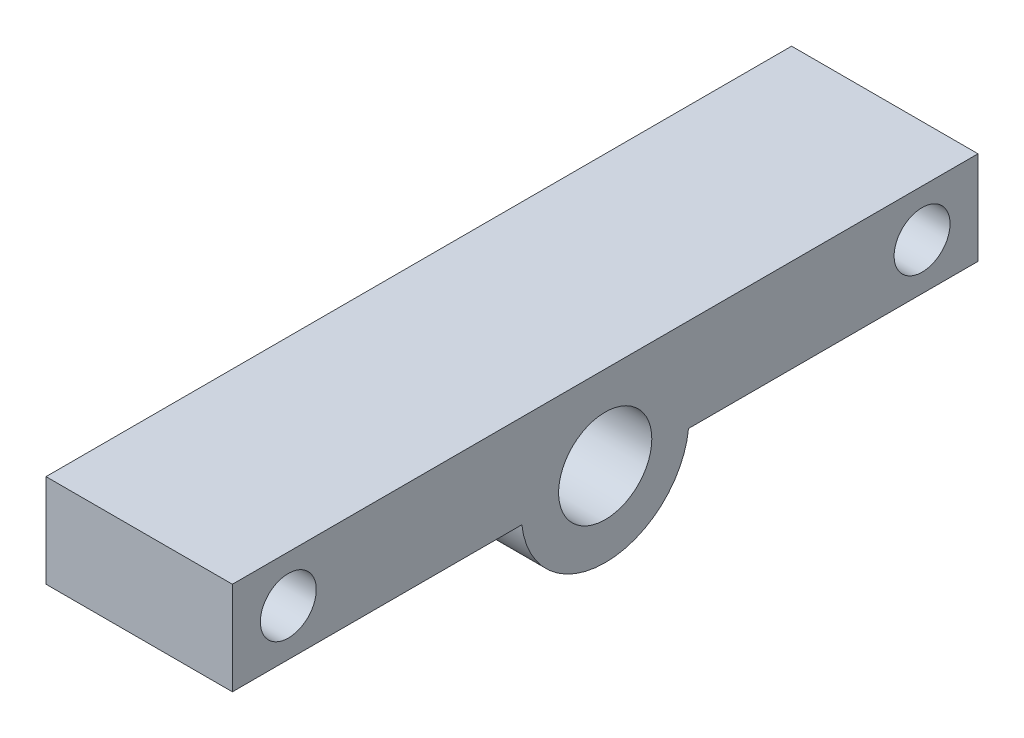
ISO-10303-21;
HEADER;
FILE_DESCRIPTION(('STEP AP214'),'2;1');
FILE_NAME('part.step','',(''),(''),'','','');
FILE_SCHEMA(('AUTOMOTIVE_DESIGN { 1 0 10303 214 1 1 1 1 }'));
ENDSEC;
DATA;
#1=APPLICATION_CONTEXT('core data for automotive mechanical design processes');
#2=APPLICATION_PROTOCOL_DEFINITION('international standard','automotive_design',2000,#1);
#3=PRODUCT_CONTEXT('',#1,'mechanical');
#4=PRODUCT('Part','Part','',(#3));
#5=PRODUCT_RELATED_PRODUCT_CATEGORY('part','',(#4));
#6=PRODUCT_DEFINITION_FORMATION('','',#4);
#7=PRODUCT_DEFINITION_CONTEXT('part definition',#1,'design');
#8=PRODUCT_DEFINITION('design','',#6,#7);
#9=PRODUCT_DEFINITION_SHAPE('','',#8);
#10=(LENGTH_UNIT() NAMED_UNIT(*) SI_UNIT(.MILLI.,.METRE.));
#11=(NAMED_UNIT(*) PLANE_ANGLE_UNIT() SI_UNIT($,.RADIAN.));
#12=(NAMED_UNIT(*) SI_UNIT($,.STERADIAN.) SOLID_ANGLE_UNIT());
#13=UNCERTAINTY_MEASURE_WITH_UNIT(LENGTH_MEASURE(1.E-05),#10,'distance_accuracy_value','');
#14=(GEOMETRIC_REPRESENTATION_CONTEXT(3) GLOBAL_UNCERTAINTY_ASSIGNED_CONTEXT((#13)) GLOBAL_UNIT_ASSIGNED_CONTEXT((#10,
#11,#12)) REPRESENTATION_CONTEXT('',''));
#15=CARTESIAN_POINT('',(0.,0.,0.));
#16=DIRECTION('',(0.,0.,1.));
#17=DIRECTION('',(1.,0.,0.));
#18=AXIS2_PLACEMENT_3D('',#15,#16,#17);
#19=CARTESIAN_POINT('',(10.,0.,0.));
#20=DIRECTION('',(1.,0.,0.));
#21=DIRECTION('',(0.,0.,-1.));
#22=AXIS2_PLACEMENT_3D('',#19,#20,#21);
#23=PLANE('',#22);
#24=CARTESIAN_POINT('',(10.,2.,-17.));
#25=DIRECTION('',(1.,0.,0.));
#26=DIRECTION('',(0.,0.,-1.));
#27=AXIS2_PLACEMENT_3D('',#24,#25,#26);
#28=CIRCLE('',#27,1.5);
#29=CARTESIAN_POINT('',(10.,2.,-18.5));
#30=VERTEX_POINT('',#29);
#31=EDGE_CURVE('E207',#30,#30,#28,.T.);
#32=ORIENTED_EDGE('',*,*,#31,.F.);
#33=EDGE_LOOP('',(#32));
#34=FACE_BOUND('',#33,.T.);
#35=CARTESIAN_POINT('',(10.,0.,0.));
#36=DIRECTION('',(1.,0.,0.));
#37=DIRECTION('',(0.,0.,-1.));
#38=AXIS2_PLACEMENT_3D('',#35,#36,#37);
#39=CIRCLE('',#38,4.5);
#40=CARTESIAN_POINT('',(10.,-0.500000000000002,4.47213595499958));
#41=VERTEX_POINT('',#40);
#42=CARTESIAN_POINT('',(10.,-0.500000000000002,-4.47213595499958));
#43=VERTEX_POINT('',#42);
#44=EDGE_CURVE('E146',#41,#43,#39,.T.);
#45=ORIENTED_EDGE('',*,*,#44,.T.);
#46=DIRECTION('',(0.,0.,-1.));
#47=VECTOR('',#46,1.);
#48=CARTESIAN_POINT('',(10.,-0.500000000000003,-20.));
#49=LINE('',#48,#47);
#50=CARTESIAN_POINT('',(10.,-0.500000000000003,-20.));
#51=VERTEX_POINT('',#50);
#52=EDGE_CURVE('E94',#43,#51,#49,.T.);
#53=ORIENTED_EDGE('',*,*,#52,.T.);
#54=DIRECTION('',(0.,1.,0.));
#55=VECTOR('',#54,1.);
#56=CARTESIAN_POINT('',(10.,4.5,-20.));
#57=LINE('',#56,#55);
#58=CARTESIAN_POINT('',(10.,4.5,-20.));
#59=VERTEX_POINT('',#58);
#60=EDGE_CURVE('E107',#51,#59,#57,.T.);
#61=ORIENTED_EDGE('',*,*,#60,.T.);
#62=DIRECTION('',(0.,0.,1.));
#63=VECTOR('',#62,1.);
#64=CARTESIAN_POINT('',(10.,4.5,20.));
#65=LINE('',#64,#63);
#66=CARTESIAN_POINT('',(10.,4.5,20.));
#67=VERTEX_POINT('',#66);
#68=EDGE_CURVE('E101',#59,#67,#65,.T.);
#69=ORIENTED_EDGE('',*,*,#68,.T.);
#70=DIRECTION('',(0.,-1.,0.));
#71=VECTOR('',#70,1.);
#72=CARTESIAN_POINT('',(10.,4.5,20.));
#73=LINE('',#72,#71);
#74=CARTESIAN_POINT('',(10.,-0.500000000000003,20.));
#75=VERTEX_POINT('',#74);
#76=EDGE_CURVE('E105',#67,#75,#73,.T.);
#77=ORIENTED_EDGE('',*,*,#76,.T.);
#78=DIRECTION('',(0.,0.,-1.));
#79=VECTOR('',#78,1.);
#80=CARTESIAN_POINT('',(10.,-0.500000000000003,20.));
#81=LINE('',#80,#79);
#82=EDGE_CURVE('E57',#75,#41,#81,.T.);
#83=ORIENTED_EDGE('',*,*,#82,.T.);
#84=EDGE_LOOP('',(#45,#53,#61,#69,#77,#83));
#85=FACE_BOUND('',#84,.T.);
#86=CARTESIAN_POINT('',(10.,0.,0.));
#87=DIRECTION('',(1.,0.,0.));
#88=DIRECTION('',(0.,0.,-1.));
#89=AXIS2_PLACEMENT_3D('',#86,#87,#88);
#90=CIRCLE('',#89,2.5);
#91=CARTESIAN_POINT('',(10.,0.,-2.5));
#92=VERTEX_POINT('',#91);
#93=EDGE_CURVE('E134',#92,#92,#90,.T.);
#94=ORIENTED_EDGE('',*,*,#93,.F.);
#95=EDGE_LOOP('',(#94));
#96=FACE_BOUND('',#95,.T.);
#97=CARTESIAN_POINT('',(10.,2.,17.));
#98=DIRECTION('',(1.,0.,0.));
#99=DIRECTION('',(0.,0.,1.));
#100=AXIS2_PLACEMENT_3D('',#97,#98,#99);
#101=CIRCLE('',#100,1.5);
#102=CARTESIAN_POINT('',(10.,2.,18.5));
#103=VERTEX_POINT('',#102);
#104=EDGE_CURVE('E196',#103,#103,#101,.T.);
#105=ORIENTED_EDGE('',*,*,#104,.F.);
#106=EDGE_LOOP('',(#105));
#107=FACE_BOUND('',#106,.T.);
#108=ADVANCED_FACE('F39',(#34,#85,#96,#107),#23,.T.);
#109=CARTESIAN_POINT('',(0.,0.,0.));
#110=DIRECTION('',(1.,0.,0.));
#111=DIRECTION('',(0.,0.,-1.));
#112=AXIS2_PLACEMENT_3D('',#109,#110,#111);
#113=PLANE('',#112);
#114=CARTESIAN_POINT('',(0.,0.,0.));
#115=DIRECTION('',(1.,0.,0.));
#116=DIRECTION('',(0.,0.,-1.));
#117=AXIS2_PLACEMENT_3D('',#114,#115,#116);
#118=CIRCLE('',#117,4.5);
#119=CARTESIAN_POINT('',(0.,-0.500000000000002,4.47213595499958));
#120=VERTEX_POINT('',#119);
#121=CARTESIAN_POINT('',(0.,-0.500000000000002,-4.47213595499958));
#122=VERTEX_POINT('',#121);
#123=EDGE_CURVE('E129',#120,#122,#118,.T.);
#124=ORIENTED_EDGE('',*,*,#123,.F.);
#125=DIRECTION('',(0.,0.,-1.));
#126=VECTOR('',#125,1.);
#127=CARTESIAN_POINT('',(0.,-0.500000000000003,20.));
#128=LINE('',#127,#126);
#129=CARTESIAN_POINT('',(0.,-0.500000000000003,20.));
#130=VERTEX_POINT('',#129);
#131=EDGE_CURVE('E86',#130,#120,#128,.T.);
#132=ORIENTED_EDGE('',*,*,#131,.F.);
#133=DIRECTION('',(0.,-1.,0.));
#134=VECTOR('',#133,1.);
#135=CARTESIAN_POINT('',(0.,4.5,20.));
#136=LINE('',#135,#134);
#137=CARTESIAN_POINT('',(0.,4.5,20.));
#138=VERTEX_POINT('',#137);
#139=EDGE_CURVE('E80',#138,#130,#136,.T.);
#140=ORIENTED_EDGE('',*,*,#139,.F.);
#141=DIRECTION('',(0.,0.,1.));
#142=VECTOR('',#141,1.);
#143=CARTESIAN_POINT('',(0.,4.5,20.));
#144=LINE('',#143,#142);
#145=CARTESIAN_POINT('',(0.,4.5,-20.));
#146=VERTEX_POINT('',#145);
#147=EDGE_CURVE('E116',#146,#138,#144,.T.);
#148=ORIENTED_EDGE('',*,*,#147,.F.);
#149=DIRECTION('',(0.,1.,0.));
#150=VECTOR('',#149,1.);
#151=CARTESIAN_POINT('',(0.,4.5,-20.));
#152=LINE('',#151,#150);
#153=CARTESIAN_POINT('',(0.,-0.500000000000003,-20.));
#154=VERTEX_POINT('',#153);
#155=EDGE_CURVE('E137',#154,#146,#152,.T.);
#156=ORIENTED_EDGE('',*,*,#155,.F.);
#157=DIRECTION('',(0.,0.,-1.));
#158=VECTOR('',#157,1.);
#159=CARTESIAN_POINT('',(0.,-0.500000000000003,-20.));
#160=LINE('',#159,#158);
#161=EDGE_CURVE('E133',#122,#154,#160,.T.);
#162=ORIENTED_EDGE('',*,*,#161,.F.);
#163=EDGE_LOOP('',(#124,#132,#140,#148,#156,#162));
#164=FACE_BOUND('',#163,.T.);
#165=CARTESIAN_POINT('',(0.,0.,0.));
#166=DIRECTION('',(1.,0.,0.));
#167=DIRECTION('',(0.,0.,-1.));
#168=AXIS2_PLACEMENT_3D('',#165,#166,#167);
#169=CIRCLE('',#168,2.5);
#170=CARTESIAN_POINT('',(0.,0.,-2.5));
#171=VERTEX_POINT('',#170);
#172=EDGE_CURVE('E211',#171,#171,#169,.T.);
#173=ORIENTED_EDGE('',*,*,#172,.T.);
#174=EDGE_LOOP('',(#173));
#175=FACE_BOUND('',#174,.T.);
#176=CARTESIAN_POINT('',(0.,2.,-17.));
#177=DIRECTION('',(1.,0.,0.));
#178=DIRECTION('',(0.,0.,-1.));
#179=AXIS2_PLACEMENT_3D('',#176,#177,#178);
#180=CIRCLE('',#179,1.5);
#181=CARTESIAN_POINT('',(0.,2.,-18.5));
#182=VERTEX_POINT('',#181);
#183=EDGE_CURVE('E204',#182,#182,#180,.T.);
#184=ORIENTED_EDGE('',*,*,#183,.T.);
#185=EDGE_LOOP('',(#184));
#186=FACE_BOUND('',#185,.T.);
#187=CARTESIAN_POINT('',(0.,2.,17.));
#188=DIRECTION('',(1.,0.,0.));
#189=DIRECTION('',(0.,0.,1.));
#190=AXIS2_PLACEMENT_3D('',#187,#188,#189);
#191=CIRCLE('',#190,1.5);
#192=CARTESIAN_POINT('',(0.,2.,18.5));
#193=VERTEX_POINT('',#192);
#194=EDGE_CURVE('E199',#193,#193,#191,.T.);
#195=ORIENTED_EDGE('',*,*,#194,.T.);
#196=EDGE_LOOP('',(#195));
#197=FACE_BOUND('',#196,.T.);
#198=ADVANCED_FACE('F159',(#164,#175,#186,#197),#113,.F.);
#199=CARTESIAN_POINT('',(10.,0.,0.));
#200=DIRECTION('',(-1.,0.,0.));
#201=DIRECTION('',(0.,0.,1.));
#202=AXIS2_PLACEMENT_3D('',#199,#200,#201);
#203=CYLINDRICAL_SURFACE('',#202,4.5);
#204=ORIENTED_EDGE('',*,*,#123,.T.);
#205=DIRECTION('',(-1.,0.,0.));
#206=VECTOR('',#205,1.);
#207=CARTESIAN_POINT('',(10.,-0.500000000000002,-4.47213595499958));
#208=LINE('',#207,#206);
#209=EDGE_CURVE('E11',#43,#122,#208,.T.);
#210=ORIENTED_EDGE('',*,*,#209,.F.);
#211=ORIENTED_EDGE('',*,*,#44,.F.);
#212=DIRECTION('',(-1.,0.,0.));
#213=VECTOR('',#212,1.);
#214=CARTESIAN_POINT('',(10.,-0.500000000000002,4.47213595499958));
#215=LINE('',#214,#213);
#216=EDGE_CURVE('E125',#41,#120,#215,.T.);
#217=ORIENTED_EDGE('',*,*,#216,.T.);
#218=EDGE_LOOP('',(#204,#210,#211,#217));
#219=FACE_BOUND('',#218,.T.);
#220=ADVANCED_FACE('F41',(#219),#203,.T.);
#221=CARTESIAN_POINT('',(10.,-0.500000000000003,-20.));
#222=DIRECTION('',(0.,1.,0.));
#223=DIRECTION('',(0.,0.,1.));
#224=AXIS2_PLACEMENT_3D('',#221,#222,#223);
#225=PLANE('',#224);
#226=ORIENTED_EDGE('',*,*,#161,.T.);
#227=DIRECTION('',(-1.,0.,0.));
#228=VECTOR('',#227,1.);
#229=CARTESIAN_POINT('',(10.,-0.500000000000003,-20.));
#230=LINE('',#229,#228);
#231=EDGE_CURVE('E49',#51,#154,#230,.T.);
#232=ORIENTED_EDGE('',*,*,#231,.F.);
#233=ORIENTED_EDGE('',*,*,#52,.F.);
#234=ORIENTED_EDGE('',*,*,#209,.T.);
#235=EDGE_LOOP('',(#226,#232,#233,#234));
#236=FACE_BOUND('',#235,.T.);
#237=ADVANCED_FACE('F267',(#236),#225,.F.);
#238=CARTESIAN_POINT('',(10.,4.5,-20.));
#239=DIRECTION('',(0.,0.,1.));
#240=DIRECTION('',(1.,0.,0.));
#241=AXIS2_PLACEMENT_3D('',#238,#239,#240);
#242=PLANE('',#241);
#243=ORIENTED_EDGE('',*,*,#155,.T.);
#244=DIRECTION('',(-1.,0.,0.));
#245=VECTOR('',#244,1.);
#246=CARTESIAN_POINT('',(10.,4.5,-20.));
#247=LINE('',#246,#245);
#248=EDGE_CURVE('E118',#59,#146,#247,.T.);
#249=ORIENTED_EDGE('',*,*,#248,.F.);
#250=ORIENTED_EDGE('',*,*,#60,.F.);
#251=ORIENTED_EDGE('',*,*,#231,.T.);
#252=EDGE_LOOP('',(#243,#249,#250,#251));
#253=FACE_BOUND('',#252,.T.);
#254=ADVANCED_FACE('F156',(#253),#242,.F.);
#255=CARTESIAN_POINT('',(10.,4.5,20.));
#256=DIRECTION('',(0.,-1.,0.));
#257=DIRECTION('',(0.,0.,-1.));
#258=AXIS2_PLACEMENT_3D('',#255,#256,#257);
#259=PLANE('',#258);
#260=ORIENTED_EDGE('',*,*,#147,.T.);
#261=DIRECTION('',(-1.,0.,0.));
#262=VECTOR('',#261,1.);
#263=CARTESIAN_POINT('',(10.,4.5,20.));
#264=LINE('',#263,#262);
#265=EDGE_CURVE('E113',#67,#138,#264,.T.);
#266=ORIENTED_EDGE('',*,*,#265,.F.);
#267=ORIENTED_EDGE('',*,*,#68,.F.);
#268=ORIENTED_EDGE('',*,*,#248,.T.);
#269=EDGE_LOOP('',(#260,#266,#267,#268));
#270=FACE_BOUND('',#269,.T.);
#271=ADVANCED_FACE('F114',(#270),#259,.F.);
#272=CARTESIAN_POINT('',(10.,4.5,20.));
#273=DIRECTION('',(0.,0.,-1.));
#274=DIRECTION('',(-1.,0.,0.));
#275=AXIS2_PLACEMENT_3D('',#272,#273,#274);
#276=PLANE('',#275);
#277=ORIENTED_EDGE('',*,*,#139,.T.);
#278=DIRECTION('',(-1.,0.,0.));
#279=VECTOR('',#278,1.);
#280=CARTESIAN_POINT('',(10.,-0.500000000000003,20.));
#281=LINE('',#280,#279);
#282=EDGE_CURVE('E119',#75,#130,#281,.T.);
#283=ORIENTED_EDGE('',*,*,#282,.F.);
#284=ORIENTED_EDGE('',*,*,#76,.F.);
#285=ORIENTED_EDGE('',*,*,#265,.T.);
#286=EDGE_LOOP('',(#277,#283,#284,#285));
#287=FACE_BOUND('',#286,.T.);
#288=ADVANCED_FACE('F121',(#287),#276,.F.);
#289=CARTESIAN_POINT('',(10.,-0.500000000000003,20.));
#290=DIRECTION('',(0.,1.,0.));
#291=DIRECTION('',(0.,0.,1.));
#292=AXIS2_PLACEMENT_3D('',#289,#290,#291);
#293=PLANE('',#292);
#294=ORIENTED_EDGE('',*,*,#131,.T.);
#295=ORIENTED_EDGE('',*,*,#216,.F.);
#296=ORIENTED_EDGE('',*,*,#82,.F.);
#297=ORIENTED_EDGE('',*,*,#282,.T.);
#298=EDGE_LOOP('',(#294,#295,#296,#297));
#299=FACE_BOUND('',#298,.T.);
#300=ADVANCED_FACE('F164',(#299),#293,.F.);
#301=CARTESIAN_POINT('',(10.,0.,0.));
#302=DIRECTION('',(-1.,0.,0.));
#303=DIRECTION('',(0.,0.,1.));
#304=AXIS2_PLACEMENT_3D('',#301,#302,#303);
#305=CYLINDRICAL_SURFACE('',#304,2.5);
#306=ORIENTED_EDGE('',*,*,#93,.T.);
#307=EDGE_LOOP('',(#306));
#308=FACE_BOUND('',#307,.T.);
#309=ORIENTED_EDGE('',*,*,#172,.F.);
#310=EDGE_LOOP('',(#309));
#311=FACE_BOUND('',#310,.T.);
#312=ADVANCED_FACE('F166',(#308,#311),#305,.F.);
#313=CARTESIAN_POINT('',(10.,2.,-17.));
#314=DIRECTION('',(-1.,0.,0.));
#315=DIRECTION('',(0.,0.,1.));
#316=AXIS2_PLACEMENT_3D('',#313,#314,#315);
#317=CYLINDRICAL_SURFACE('',#316,1.5);
#318=ORIENTED_EDGE('',*,*,#31,.T.);
#319=EDGE_LOOP('',(#318));
#320=FACE_BOUND('',#319,.T.);
#321=ORIENTED_EDGE('',*,*,#183,.F.);
#322=EDGE_LOOP('',(#321));
#323=FACE_BOUND('',#322,.T.);
#324=ADVANCED_FACE('F172',(#320,#323),#317,.F.);
#325=CARTESIAN_POINT('',(10.,2.,17.));
#326=DIRECTION('',(-1.,0.,0.));
#327=DIRECTION('',(0.,0.,1.));
#328=AXIS2_PLACEMENT_3D('',#325,#326,#327);
#329=CYLINDRICAL_SURFACE('',#328,1.5);
#330=ORIENTED_EDGE('',*,*,#104,.T.);
#331=EDGE_LOOP('',(#330));
#332=FACE_BOUND('',#331,.T.);
#333=ORIENTED_EDGE('',*,*,#194,.F.);
#334=EDGE_LOOP('',(#333));
#335=FACE_BOUND('',#334,.T.);
#336=ADVANCED_FACE('F187',(#332,#335),#329,.F.);
#337=CLOSED_SHELL('',(#108,#198,#220,#237,#254,#271,#288,#300,#312,#324,#336));
#338=MANIFOLD_SOLID_BREP('B2',#337);
#339=ADVANCED_BREP_SHAPE_REPRESENTATION('',(#18,#338),#14);
#340=SHAPE_DEFINITION_REPRESENTATION(#9,#339);
ENDSEC;
END-ISO-10303-21;
